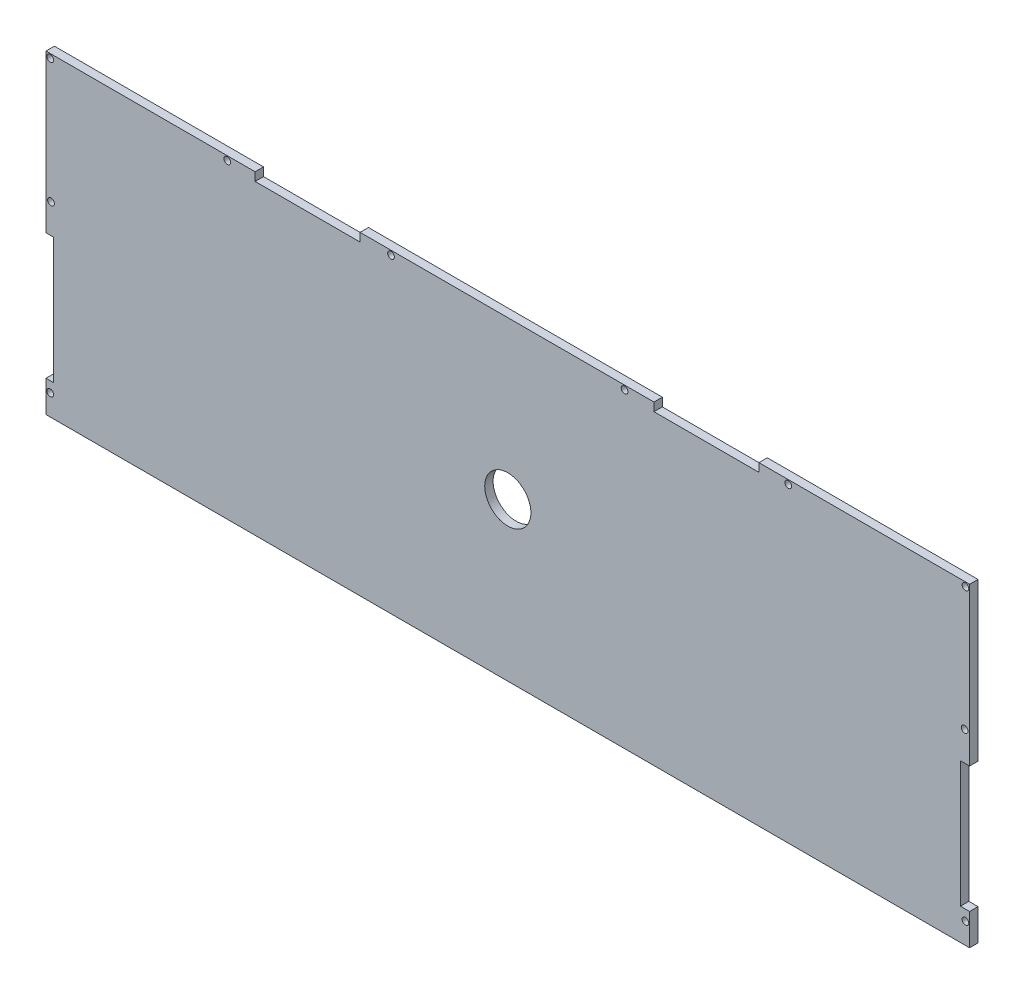
ISO-10303-21;
HEADER;
FILE_DESCRIPTION(('STEP AP214'),'2;1');
FILE_NAME('part.step','',(''),(''),'','','');
FILE_SCHEMA(('AUTOMOTIVE_DESIGN { 1 0 10303 214 1 1 1 1 }'));
ENDSEC;
DATA;
#1=APPLICATION_CONTEXT('core data for automotive mechanical design processes');
#2=APPLICATION_PROTOCOL_DEFINITION('international standard','automotive_design',2000,#1);
#3=PRODUCT_CONTEXT('',#1,'mechanical');
#4=PRODUCT('Part','Part','',(#3));
#5=PRODUCT_RELATED_PRODUCT_CATEGORY('part','',(#4));
#6=PRODUCT_DEFINITION_FORMATION('','',#4);
#7=PRODUCT_DEFINITION_CONTEXT('part definition',#1,'design');
#8=PRODUCT_DEFINITION('design','',#6,#7);
#9=PRODUCT_DEFINITION_SHAPE('','',#8);
#10=(LENGTH_UNIT() NAMED_UNIT(*) SI_UNIT(.MILLI.,.METRE.));
#11=(NAMED_UNIT(*) PLANE_ANGLE_UNIT() SI_UNIT($,.RADIAN.));
#12=(NAMED_UNIT(*) SI_UNIT($,.STERADIAN.) SOLID_ANGLE_UNIT());
#13=UNCERTAINTY_MEASURE_WITH_UNIT(LENGTH_MEASURE(1.E-05),#10,'distance_accuracy_value','');
#14=(GEOMETRIC_REPRESENTATION_CONTEXT(3) GLOBAL_UNCERTAINTY_ASSIGNED_CONTEXT((#13)) GLOBAL_UNIT_ASSIGNED_CONTEXT((#10,
#11,#12)) REPRESENTATION_CONTEXT('',''));
#15=CARTESIAN_POINT('',(0.,0.,0.));
#16=DIRECTION('',(0.,0.,1.));
#17=DIRECTION('',(1.,0.,0.));
#18=AXIS2_PLACEMENT_3D('',#15,#16,#17);
#19=CARTESIAN_POINT('',(-220.,-75.,4.));
#20=DIRECTION('',(1.,0.,0.));
#21=DIRECTION('',(0.,0.,-1.));
#22=AXIS2_PLACEMENT_3D('',#19,#20,#21);
#23=PLANE('',#22);
#24=DIRECTION('',(0.,-1.,0.));
#25=VECTOR('',#24,1.);
#26=CARTESIAN_POINT('',(-220.,-75.,0.));
#27=LINE('',#26,#25);
#28=CARTESIAN_POINT('',(-220.,75.,0.));
#29=VERTEX_POINT('',#28);
#30=CARTESIAN_POINT('',(-220.,0.,0.));
#31=VERTEX_POINT('',#30);
#32=EDGE_CURVE('E305',#29,#31,#27,.T.);
#33=ORIENTED_EDGE('',*,*,#32,.T.);
#34=DIRECTION('',(0.,0.,-1.));
#35=VECTOR('',#34,1.);
#36=CARTESIAN_POINT('',(-220.,0.,4.));
#37=LINE('',#36,#35);
#38=CARTESIAN_POINT('',(-220.,0.,4.));
#39=VERTEX_POINT('',#38);
#40=EDGE_CURVE('E205',#39,#31,#37,.T.);
#41=ORIENTED_EDGE('',*,*,#40,.F.);
#42=DIRECTION('',(0.,-1.,0.));
#43=VECTOR('',#42,1.);
#44=CARTESIAN_POINT('',(-220.,-75.,4.));
#45=LINE('',#44,#43);
#46=CARTESIAN_POINT('',(-220.,75.,4.));
#47=VERTEX_POINT('',#46);
#48=EDGE_CURVE('E290',#47,#39,#45,.T.);
#49=ORIENTED_EDGE('',*,*,#48,.F.);
#50=DIRECTION('',(0.,0.,-1.));
#51=VECTOR('',#50,1.);
#52=CARTESIAN_POINT('',(-220.,75.,4.));
#53=LINE('',#52,#51);
#54=EDGE_CURVE('E303',#47,#29,#53,.T.);
#55=ORIENTED_EDGE('',*,*,#54,.T.);
#56=EDGE_LOOP('',(#33,#41,#49,#55));
#57=FACE_BOUND('',#56,.T.);
#58=ADVANCED_FACE('F33',(#57),#23,.F.);
#59=CARTESIAN_POINT('',(220.,-75.,4.));
#60=DIRECTION('',(-1.,0.,0.));
#61=DIRECTION('',(0.,0.,1.));
#62=AXIS2_PLACEMENT_3D('',#59,#60,#61);
#63=PLANE('',#62);
#64=DIRECTION('',(0.,1.,0.));
#65=VECTOR('',#64,1.);
#66=CARTESIAN_POINT('',(220.,-75.,0.));
#67=LINE('',#66,#65);
#68=CARTESIAN_POINT('',(220.,-75.,0.));
#69=VERTEX_POINT('',#68);
#70=CARTESIAN_POINT('',(220.,-60.,0.));
#71=VERTEX_POINT('',#70);
#72=EDGE_CURVE('E311',#69,#71,#67,.T.);
#73=ORIENTED_EDGE('',*,*,#72,.T.);
#74=DIRECTION('',(0.,0.,-1.));
#75=VECTOR('',#74,1.);
#76=CARTESIAN_POINT('',(220.,-60.,4.));
#77=LINE('',#76,#75);
#78=CARTESIAN_POINT('',(220.,-60.,4.));
#79=VERTEX_POINT('',#78);
#80=EDGE_CURVE('E253',#79,#71,#77,.T.);
#81=ORIENTED_EDGE('',*,*,#80,.F.);
#82=DIRECTION('',(0.,1.,0.));
#83=VECTOR('',#82,1.);
#84=CARTESIAN_POINT('',(220.,-75.,4.));
#85=LINE('',#84,#83);
#86=CARTESIAN_POINT('',(220.,-75.,4.));
#87=VERTEX_POINT('',#86);
#88=EDGE_CURVE('E296',#87,#79,#85,.T.);
#89=ORIENTED_EDGE('',*,*,#88,.F.);
#90=DIRECTION('',(0.,0.,-1.));
#91=VECTOR('',#90,1.);
#92=CARTESIAN_POINT('',(220.,-75.,4.));
#93=LINE('',#92,#91);
#94=EDGE_CURVE('E41',#87,#69,#93,.T.);
#95=ORIENTED_EDGE('',*,*,#94,.T.);
#96=EDGE_LOOP('',(#73,#81,#89,#95));
#97=FACE_BOUND('',#96,.T.);
#98=ADVANCED_FACE('F328',(#97),#63,.F.);
#99=CARTESIAN_POINT('',(220.,75.,4.));
#100=DIRECTION('',(0.,-1.,0.));
#101=DIRECTION('',(1.,0.,0.));
#102=AXIS2_PLACEMENT_3D('',#99,#100,#101);
#103=PLANE('',#102);
#104=DIRECTION('',(-1.,0.,0.));
#105=VECTOR('',#104,1.);
#106=CARTESIAN_POINT('',(220.,75.,0.));
#107=LINE('',#106,#105);
#108=CARTESIAN_POINT('',(220.,75.,0.));
#109=VERTEX_POINT('',#108);
#110=CARTESIAN_POINT('',(119.624864111557,75.,0.));
#111=VERTEX_POINT('',#110);
#112=EDGE_CURVE('E315',#109,#111,#107,.T.);
#113=ORIENTED_EDGE('',*,*,#112,.T.);
#114=DIRECTION('',(0.,0.,-1.));
#115=VECTOR('',#114,1.);
#116=CARTESIAN_POINT('',(119.624864111557,75.,4.));
#117=LINE('',#116,#115);
#118=CARTESIAN_POINT('',(119.624864111557,75.,4.));
#119=VERTEX_POINT('',#118);
#120=EDGE_CURVE('E225',#119,#111,#117,.T.);
#121=ORIENTED_EDGE('',*,*,#120,.F.);
#122=DIRECTION('',(-1.,0.,0.));
#123=VECTOR('',#122,1.);
#124=CARTESIAN_POINT('',(220.,75.,4.));
#125=LINE('',#124,#123);
#126=CARTESIAN_POINT('',(220.,75.,4.));
#127=VERTEX_POINT('',#126);
#128=EDGE_CURVE('E300',#127,#119,#125,.T.);
#129=ORIENTED_EDGE('',*,*,#128,.F.);
#130=DIRECTION('',(0.,0.,-1.));
#131=VECTOR('',#130,1.);
#132=CARTESIAN_POINT('',(220.,75.,4.));
#133=LINE('',#132,#131);
#134=EDGE_CURVE('E321',#127,#109,#133,.T.);
#135=ORIENTED_EDGE('',*,*,#134,.T.);
#136=EDGE_LOOP('',(#113,#121,#129,#135));
#137=FACE_BOUND('',#136,.T.);
#138=ADVANCED_FACE('F393',(#137),#103,.F.);
#139=CARTESIAN_POINT('',(69.6248641115568,75.,4.));
#140=VERTEX_POINT('',#139);
#141=CARTESIAN_POINT('',(-70.3751358884429,75.,4.));
#142=VERTEX_POINT('',#141);
#143=EDGE_CURVE('E304',#140,#142,#125,.T.);
#144=ORIENTED_EDGE('',*,*,#143,.F.);
#145=DIRECTION('',(0.,0.,-1.));
#146=VECTOR('',#145,1.);
#147=CARTESIAN_POINT('',(69.6248641115568,75.,4.));
#148=LINE('',#147,#146);
#149=CARTESIAN_POINT('',(69.6248641115568,75.,0.));
#150=VERTEX_POINT('',#149);
#151=EDGE_CURVE('E228',#140,#150,#148,.T.);
#152=ORIENTED_EDGE('',*,*,#151,.T.);
#153=CARTESIAN_POINT('',(-70.3751358884429,75.,0.));
#154=VERTEX_POINT('',#153);
#155=EDGE_CURVE('E318',#150,#154,#107,.T.);
#156=ORIENTED_EDGE('',*,*,#155,.T.);
#157=DIRECTION('',(0.,0.,-1.));
#158=VECTOR('',#157,1.);
#159=CARTESIAN_POINT('',(-70.3751358884429,75.,4.));
#160=LINE('',#159,#158);
#161=EDGE_CURVE('E248',#142,#154,#160,.T.);
#162=ORIENTED_EDGE('',*,*,#161,.F.);
#163=EDGE_LOOP('',(#144,#152,#156,#162));
#164=FACE_BOUND('',#163,.T.);
#165=ADVANCED_FACE('F362',(#164),#103,.F.);
#166=CARTESIAN_POINT('',(-220.,-60.0000000000001,4.));
#167=VERTEX_POINT('',#166);
#168=CARTESIAN_POINT('',(-220.,-75.,4.));
#169=VERTEX_POINT('',#168);
#170=EDGE_CURVE('E293',#167,#169,#45,.T.);
#171=ORIENTED_EDGE('',*,*,#170,.F.);
#172=DIRECTION('',(0.,0.,-1.));
#173=VECTOR('',#172,1.);
#174=CARTESIAN_POINT('',(-220.,-60.0000000000001,4.));
#175=LINE('',#174,#173);
#176=CARTESIAN_POINT('',(-220.,-60.0000000000001,0.));
#177=VERTEX_POINT('',#176);
#178=EDGE_CURVE('E176',#167,#177,#175,.T.);
#179=ORIENTED_EDGE('',*,*,#178,.T.);
#180=CARTESIAN_POINT('',(-220.,-75.,0.));
#181=VERTEX_POINT('',#180);
#182=EDGE_CURVE('E289',#177,#181,#27,.T.);
#183=ORIENTED_EDGE('',*,*,#182,.T.);
#184=DIRECTION('',(0.,0.,-1.));
#185=VECTOR('',#184,1.);
#186=CARTESIAN_POINT('',(-220.,-75.,4.));
#187=LINE('',#186,#185);
#188=EDGE_CURVE('E11',#169,#181,#187,.T.);
#189=ORIENTED_EDGE('',*,*,#188,.F.);
#190=EDGE_LOOP('',(#171,#179,#183,#189));
#191=FACE_BOUND('',#190,.T.);
#192=ADVANCED_FACE('F35',(#191),#23,.F.);
#193=CARTESIAN_POINT('',(220.,-75.,4.));
#194=DIRECTION('',(0.,1.,0.));
#195=DIRECTION('',(-1.,0.,0.));
#196=AXIS2_PLACEMENT_3D('',#193,#194,#195);
#197=PLANE('',#196);
#198=DIRECTION('',(1.,0.,0.));
#199=VECTOR('',#198,1.);
#200=CARTESIAN_POINT('',(220.,-75.,0.));
#201=LINE('',#200,#199);
#202=EDGE_CURVE('E308',#181,#69,#201,.T.);
#203=ORIENTED_EDGE('',*,*,#202,.T.);
#204=ORIENTED_EDGE('',*,*,#94,.F.);
#205=DIRECTION('',(1.,0.,0.));
#206=VECTOR('',#205,1.);
#207=CARTESIAN_POINT('',(220.,-75.,4.));
#208=LINE('',#207,#206);
#209=EDGE_CURVE('E292',#169,#87,#208,.T.);
#210=ORIENTED_EDGE('',*,*,#209,.F.);
#211=ORIENTED_EDGE('',*,*,#188,.T.);
#212=EDGE_LOOP('',(#203,#204,#210,#211));
#213=FACE_BOUND('',#212,.T.);
#214=ADVANCED_FACE('F343',(#213),#197,.F.);
#215=CARTESIAN_POINT('',(220.,0.,4.));
#216=VERTEX_POINT('',#215);
#217=EDGE_CURVE('E295',#216,#127,#85,.T.);
#218=ORIENTED_EDGE('',*,*,#217,.F.);
#219=DIRECTION('',(0.,0.,-1.));
#220=VECTOR('',#219,1.);
#221=CARTESIAN_POINT('',(220.,0.,4.));
#222=LINE('',#221,#220);
#223=CARTESIAN_POINT('',(220.,0.,0.));
#224=VERTEX_POINT('',#223);
#225=EDGE_CURVE('E255',#216,#224,#222,.T.);
#226=ORIENTED_EDGE('',*,*,#225,.T.);
#227=EDGE_CURVE('E310',#224,#109,#67,.T.);
#228=ORIENTED_EDGE('',*,*,#227,.T.);
#229=ORIENTED_EDGE('',*,*,#134,.F.);
#230=EDGE_LOOP('',(#218,#226,#228,#229));
#231=FACE_BOUND('',#230,.T.);
#232=ADVANCED_FACE('F395',(#231),#63,.F.);
#233=CARTESIAN_POINT('',(-120.375135888443,75.,4.));
#234=VERTEX_POINT('',#233);
#235=EDGE_CURVE('E299',#234,#47,#125,.T.);
#236=ORIENTED_EDGE('',*,*,#235,.F.);
#237=DIRECTION('',(0.,0.,-1.));
#238=VECTOR('',#237,1.);
#239=CARTESIAN_POINT('',(-120.375135888443,75.,4.));
#240=LINE('',#239,#238);
#241=CARTESIAN_POINT('',(-120.375135888443,75.,0.));
#242=VERTEX_POINT('',#241);
#243=EDGE_CURVE('E277',#234,#242,#240,.T.);
#244=ORIENTED_EDGE('',*,*,#243,.T.);
#245=EDGE_CURVE('E314',#242,#29,#107,.T.);
#246=ORIENTED_EDGE('',*,*,#245,.T.);
#247=ORIENTED_EDGE('',*,*,#54,.F.);
#248=EDGE_LOOP('',(#236,#244,#246,#247));
#249=FACE_BOUND('',#248,.T.);
#250=ADVANCED_FACE('F355',(#249),#103,.F.);
#251=CARTESIAN_POINT('',(0.,0.,4.));
#252=DIRECTION('',(0.,0.,1.));
#253=DIRECTION('',(1.,0.,0.));
#254=AXIS2_PLACEMENT_3D('',#251,#252,#253);
#255=PLANE('',#254);
#256=CARTESIAN_POINT('',(133.624864111557,73.,4.));
#257=DIRECTION('',(0.,0.,-1.));
#258=DIRECTION('',(-1.,0.,0.));
#259=AXIS2_PLACEMENT_3D('',#256,#257,#258);
#260=CIRCLE('',#259,1.59999999999999);
#261=CARTESIAN_POINT('',(132.024864111557,73.,4.));
#262=VERTEX_POINT('',#261);
#263=EDGE_CURVE('E530',#262,#262,#260,.T.);
#264=ORIENTED_EDGE('',*,*,#263,.T.);
#265=EDGE_LOOP('',(#264));
#266=FACE_BOUND('',#265,.T.);
#267=CARTESIAN_POINT('',(-218.,-65.,4.));
#268=DIRECTION('',(0.,0.,-1.));
#269=DIRECTION('',(1.,0.,0.));
#270=AXIS2_PLACEMENT_3D('',#267,#268,#269);
#271=CIRCLE('',#270,1.59999999999999);
#272=CARTESIAN_POINT('',(-216.4,-65.,4.));
#273=VERTEX_POINT('',#272);
#274=EDGE_CURVE('E535',#273,#273,#271,.T.);
#275=ORIENTED_EDGE('',*,*,#274,.T.);
#276=EDGE_LOOP('',(#275));
#277=FACE_BOUND('',#276,.T.);
#278=CARTESIAN_POINT('',(55.6248641115568,73.,4.));
#279=DIRECTION('',(0.,0.,-1.));
#280=DIRECTION('',(-1.,0.,0.));
#281=AXIS2_PLACEMENT_3D('',#278,#279,#280);
#282=CIRCLE('',#281,1.59999999999999);
#283=CARTESIAN_POINT('',(54.0248641115568,73.,4.));
#284=VERTEX_POINT('',#283);
#285=EDGE_CURVE('E542',#284,#284,#282,.T.);
#286=ORIENTED_EDGE('',*,*,#285,.T.);
#287=EDGE_LOOP('',(#286));
#288=FACE_BOUND('',#287,.T.);
#289=CARTESIAN_POINT('',(-218.,73.,4.));
#290=DIRECTION('',(0.,0.,-1.));
#291=DIRECTION('',(1.,0.,0.));
#292=AXIS2_PLACEMENT_3D('',#289,#290,#291);
#293=CIRCLE('',#292,1.59999999999999);
#294=CARTESIAN_POINT('',(-216.4,73.,4.));
#295=VERTEX_POINT('',#294);
#296=EDGE_CURVE('E548',#295,#295,#293,.T.);
#297=ORIENTED_EDGE('',*,*,#296,.T.);
#298=EDGE_LOOP('',(#297));
#299=FACE_BOUND('',#298,.T.);
#300=CARTESIAN_POINT('',(-55.6248641115568,73.,4.));
#301=DIRECTION('',(0.,0.,-1.));
#302=DIRECTION('',(1.,0.,0.));
#303=AXIS2_PLACEMENT_3D('',#300,#301,#302);
#304=CIRCLE('',#303,1.59999999999999);
#305=CARTESIAN_POINT('',(-54.0248641115568,73.,4.));
#306=VERTEX_POINT('',#305);
#307=EDGE_CURVE('E504',#306,#306,#304,.T.);
#308=ORIENTED_EDGE('',*,*,#307,.T.);
#309=EDGE_LOOP('',(#308));
#310=FACE_BOUND('',#309,.T.);
#311=CARTESIAN_POINT('',(218.,73.,4.));
#312=DIRECTION('',(0.,0.,-1.));
#313=DIRECTION('',(-1.,0.,0.));
#314=AXIS2_PLACEMENT_3D('',#311,#312,#313);
#315=CIRCLE('',#314,1.59999999999999);
#316=CARTESIAN_POINT('',(216.4,73.,4.));
#317=VERTEX_POINT('',#316);
#318=EDGE_CURVE('E510',#317,#317,#315,.T.);
#319=ORIENTED_EDGE('',*,*,#318,.T.);
#320=EDGE_LOOP('',(#319));
#321=FACE_BOUND('',#320,.T.);
#322=CARTESIAN_POINT('',(218.,-65.,4.));
#323=DIRECTION('',(0.,0.,-1.));
#324=DIRECTION('',(-1.,0.,0.));
#325=AXIS2_PLACEMENT_3D('',#322,#323,#324);
#326=CIRCLE('',#325,1.59999999999999);
#327=CARTESIAN_POINT('',(216.4,-65.,4.));
#328=VERTEX_POINT('',#327);
#329=EDGE_CURVE('E517',#328,#328,#326,.T.);
#330=ORIENTED_EDGE('',*,*,#329,.T.);
#331=EDGE_LOOP('',(#330));
#332=FACE_BOUND('',#331,.T.);
#333=CARTESIAN_POINT('',(-133.624864111557,73.,4.));
#334=DIRECTION('',(0.,0.,-1.));
#335=DIRECTION('',(1.,0.,0.));
#336=AXIS2_PLACEMENT_3D('',#333,#334,#335);
#337=CIRCLE('',#336,1.59999999999999);
#338=CARTESIAN_POINT('',(-132.024864111557,73.,4.));
#339=VERTEX_POINT('',#338);
#340=EDGE_CURVE('E523',#339,#339,#337,.T.);
#341=ORIENTED_EDGE('',*,*,#340,.T.);
#342=EDGE_LOOP('',(#341));
#343=FACE_BOUND('',#342,.T.);
#344=CARTESIAN_POINT('',(-217.624864111557,14.0000000000007,4.));
#345=DIRECTION('',(0.,0.,-1.));
#346=DIRECTION('',(1.,0.,0.));
#347=AXIS2_PLACEMENT_3D('',#344,#345,#346);
#348=CIRCLE('',#347,1.59999999999999);
#349=CARTESIAN_POINT('',(-216.024864111557,14.0000000000007,4.));
#350=VERTEX_POINT('',#349);
#351=EDGE_CURVE('E555',#350,#350,#348,.T.);
#352=ORIENTED_EDGE('',*,*,#351,.T.);
#353=EDGE_LOOP('',(#352));
#354=FACE_BOUND('',#353,.T.);
#355=CARTESIAN_POINT('',(217.624864111557,14.0000000000007,4.));
#356=DIRECTION('',(0.,0.,-1.));
#357=DIRECTION('',(-1.,0.,0.));
#358=AXIS2_PLACEMENT_3D('',#355,#356,#357);
#359=CIRCLE('',#358,1.59999999999999);
#360=CARTESIAN_POINT('',(216.024864111557,14.0000000000007,4.));
#361=VERTEX_POINT('',#360);
#362=EDGE_CURVE('E221',#361,#361,#359,.T.);
#363=ORIENTED_EDGE('',*,*,#362,.T.);
#364=EDGE_LOOP('',(#363));
#365=FACE_BOUND('',#364,.T.);
#366=DIRECTION('',(1.,0.,0.));
#367=VECTOR('',#366,1.);
#368=CARTESIAN_POINT('',(-216.375135888443,0.,4.));
#369=LINE('',#368,#367);
#370=CARTESIAN_POINT('',(-216.375135888443,0.,4.));
#371=VERTEX_POINT('',#370);
#372=EDGE_CURVE('E177',#39,#371,#369,.T.);
#373=ORIENTED_EDGE('',*,*,#372,.T.);
#374=DIRECTION('',(0.,-1.,0.));
#375=VECTOR('',#374,1.);
#376=CARTESIAN_POINT('',(-216.375135888443,-60.0000000000001,4.));
#377=LINE('',#376,#375);
#378=CARTESIAN_POINT('',(-216.375135888443,-60.0000000000001,4.));
#379=VERTEX_POINT('',#378);
#380=EDGE_CURVE('E172',#371,#379,#377,.T.);
#381=ORIENTED_EDGE('',*,*,#380,.T.);
#382=DIRECTION('',(-1.,0.,0.));
#383=VECTOR('',#382,1.);
#384=CARTESIAN_POINT('',(-216.375135888443,-60.0000000000001,4.));
#385=LINE('',#384,#383);
#386=EDGE_CURVE('E180',#379,#167,#385,.T.);
#387=ORIENTED_EDGE('',*,*,#386,.T.);
#388=ORIENTED_EDGE('',*,*,#170,.T.);
#389=ORIENTED_EDGE('',*,*,#209,.T.);
#390=ORIENTED_EDGE('',*,*,#88,.T.);
#391=DIRECTION('',(-1.,0.,0.));
#392=VECTOR('',#391,1.);
#393=CARTESIAN_POINT('',(215.624864111557,-60.,4.));
#394=LINE('',#393,#392);
#395=CARTESIAN_POINT('',(215.624864111557,-60.,4.));
#396=VERTEX_POINT('',#395);
#397=EDGE_CURVE('E241',#79,#396,#394,.T.);
#398=ORIENTED_EDGE('',*,*,#397,.T.);
#399=DIRECTION('',(0.,1.,0.));
#400=VECTOR('',#399,1.);
#401=CARTESIAN_POINT('',(215.624864111557,-60.,4.));
#402=LINE('',#401,#400);
#403=CARTESIAN_POINT('',(215.624864111557,0.,4.));
#404=VERTEX_POINT('',#403);
#405=EDGE_CURVE('E234',#396,#404,#402,.T.);
#406=ORIENTED_EDGE('',*,*,#405,.T.);
#407=DIRECTION('',(1.,0.,0.));
#408=VECTOR('',#407,1.);
#409=CARTESIAN_POINT('',(215.624864111557,0.,4.));
#410=LINE('',#409,#408);
#411=EDGE_CURVE('E237',#404,#216,#410,.T.);
#412=ORIENTED_EDGE('',*,*,#411,.T.);
#413=ORIENTED_EDGE('',*,*,#217,.T.);
#414=ORIENTED_EDGE('',*,*,#128,.T.);
#415=DIRECTION('',(0.,-1.,0.));
#416=VECTOR('',#415,1.);
#417=CARTESIAN_POINT('',(119.624864111557,70.9999999999998,4.));
#418=LINE('',#417,#416);
#419=CARTESIAN_POINT('',(119.624864111557,70.9999999999998,4.));
#420=VERTEX_POINT('',#419);
#421=EDGE_CURVE('E208',#119,#420,#418,.T.);
#422=ORIENTED_EDGE('',*,*,#421,.T.);
#423=DIRECTION('',(-1.,0.,0.));
#424=VECTOR('',#423,1.);
#425=CARTESIAN_POINT('',(119.624864111557,70.9999999999998,4.));
#426=LINE('',#425,#424);
#427=CARTESIAN_POINT('',(69.6248641115568,70.9999999999998,4.));
#428=VERTEX_POINT('',#427);
#429=EDGE_CURVE('E211',#420,#428,#426,.T.);
#430=ORIENTED_EDGE('',*,*,#429,.T.);
#431=DIRECTION('',(0.,1.,0.));
#432=VECTOR('',#431,1.);
#433=CARTESIAN_POINT('',(69.6248641115568,70.9999999999998,4.));
#434=LINE('',#433,#432);
#435=EDGE_CURVE('E215',#428,#140,#434,.T.);
#436=ORIENTED_EDGE('',*,*,#435,.T.);
#437=ORIENTED_EDGE('',*,*,#143,.T.);
#438=DIRECTION('',(0.,-1.,0.));
#439=VECTOR('',#438,1.);
#440=CARTESIAN_POINT('',(-70.3751358884429,70.9999999999998,4.));
#441=LINE('',#440,#439);
#442=CARTESIAN_POINT('',(-70.3751358884429,70.9999999999998,4.));
#443=VERTEX_POINT('',#442);
#444=EDGE_CURVE('E260',#142,#443,#441,.T.);
#445=ORIENTED_EDGE('',*,*,#444,.T.);
#446=DIRECTION('',(-1.,0.,0.));
#447=VECTOR('',#446,1.);
#448=CARTESIAN_POINT('',(-70.3751358884429,70.9999999999998,4.));
#449=LINE('',#448,#447);
#450=CARTESIAN_POINT('',(-120.375135888443,70.9999999999998,4.));
#451=VERTEX_POINT('',#450);
#452=EDGE_CURVE('E263',#443,#451,#449,.T.);
#453=ORIENTED_EDGE('',*,*,#452,.T.);
#454=DIRECTION('',(0.,1.,0.));
#455=VECTOR('',#454,1.);
#456=CARTESIAN_POINT('',(-120.375135888443,70.9999999999998,4.));
#457=LINE('',#456,#455);
#458=EDGE_CURVE('E267',#451,#234,#457,.T.);
#459=ORIENTED_EDGE('',*,*,#458,.T.);
#460=ORIENTED_EDGE('',*,*,#235,.T.);
#461=ORIENTED_EDGE('',*,*,#48,.T.);
#462=EDGE_LOOP('',(#373,#381,#387,#388,#389,#390,#398,#406,#412,#413,#414,#422,#430,#436,#437,
#445,#453,#459,#460,#461));
#463=FACE_BOUND('',#462,.T.);
#464=CARTESIAN_POINT('',(0.,0.,4.));
#465=DIRECTION('',(0.,0.,1.));
#466=DIRECTION('',(1.,0.,0.));
#467=AXIS2_PLACEMENT_3D('',#464,#465,#466);
#468=CIRCLE('',#467,11.);
#469=CARTESIAN_POINT('',(11.,0.,4.));
#470=VERTEX_POINT('',#469);
#471=EDGE_CURVE('E286',#470,#470,#468,.T.);
#472=ORIENTED_EDGE('',*,*,#471,.F.);
#473=EDGE_LOOP('',(#472));
#474=FACE_BOUND('',#473,.T.);
#475=ADVANCED_FACE('F186',(#266,#277,#288,#299,#310,#321,#332,#343,#354,#365,#463,#474),#255,.T.);
#476=CARTESIAN_POINT('',(0.,0.,0.));
#477=DIRECTION('',(0.,0.,1.));
#478=DIRECTION('',(1.,0.,0.));
#479=AXIS2_PLACEMENT_3D('',#476,#477,#478);
#480=PLANE('',#479);
#481=CARTESIAN_POINT('',(133.624864111557,73.,0.));
#482=DIRECTION('',(0.,0.,-1.));
#483=DIRECTION('',(-1.,0.,0.));
#484=AXIS2_PLACEMENT_3D('',#481,#482,#483);
#485=CIRCLE('',#484,1.59999999999999);
#486=CARTESIAN_POINT('',(132.024864111557,73.,0.));
#487=VERTEX_POINT('',#486);
#488=EDGE_CURVE('E468',#487,#487,#485,.T.);
#489=ORIENTED_EDGE('',*,*,#488,.F.);
#490=EDGE_LOOP('',(#489));
#491=FACE_BOUND('',#490,.T.);
#492=CARTESIAN_POINT('',(-218.,-65.,0.));
#493=DIRECTION('',(0.,0.,-1.));
#494=DIRECTION('',(1.,0.,0.));
#495=AXIS2_PLACEMENT_3D('',#492,#493,#494);
#496=CIRCLE('',#495,1.59999999999999);
#497=CARTESIAN_POINT('',(-216.4,-65.,0.));
#498=VERTEX_POINT('',#497);
#499=EDGE_CURVE('E472',#498,#498,#496,.T.);
#500=ORIENTED_EDGE('',*,*,#499,.F.);
#501=EDGE_LOOP('',(#500));
#502=FACE_BOUND('',#501,.T.);
#503=CARTESIAN_POINT('',(55.6248641115568,73.,0.));
#504=DIRECTION('',(0.,0.,-1.));
#505=DIRECTION('',(-1.,0.,0.));
#506=AXIS2_PLACEMENT_3D('',#503,#504,#505);
#507=CIRCLE('',#506,1.59999999999999);
#508=CARTESIAN_POINT('',(54.0248641115568,73.,0.));
#509=VERTEX_POINT('',#508);
#510=EDGE_CURVE('E476',#509,#509,#507,.T.);
#511=ORIENTED_EDGE('',*,*,#510,.F.);
#512=EDGE_LOOP('',(#511));
#513=FACE_BOUND('',#512,.T.);
#514=CARTESIAN_POINT('',(-218.,73.,0.));
#515=DIRECTION('',(0.,0.,-1.));
#516=DIRECTION('',(1.,0.,0.));
#517=AXIS2_PLACEMENT_3D('',#514,#515,#516);
#518=CIRCLE('',#517,1.59999999999999);
#519=CARTESIAN_POINT('',(-216.4,73.,0.));
#520=VERTEX_POINT('',#519);
#521=EDGE_CURVE('E480',#520,#520,#518,.T.);
#522=ORIENTED_EDGE('',*,*,#521,.F.);
#523=EDGE_LOOP('',(#522));
#524=FACE_BOUND('',#523,.T.);
#525=CARTESIAN_POINT('',(-55.6248641115568,73.,0.));
#526=DIRECTION('',(0.,0.,-1.));
#527=DIRECTION('',(1.,0.,0.));
#528=AXIS2_PLACEMENT_3D('',#525,#526,#527);
#529=CIRCLE('',#528,1.59999999999999);
#530=CARTESIAN_POINT('',(-54.0248641115568,73.,0.));
#531=VERTEX_POINT('',#530);
#532=EDGE_CURVE('E484',#531,#531,#529,.T.);
#533=ORIENTED_EDGE('',*,*,#532,.F.);
#534=EDGE_LOOP('',(#533));
#535=FACE_BOUND('',#534,.T.);
#536=CARTESIAN_POINT('',(218.,73.,0.));
#537=DIRECTION('',(0.,0.,-1.));
#538=DIRECTION('',(-1.,0.,0.));
#539=AXIS2_PLACEMENT_3D('',#536,#537,#538);
#540=CIRCLE('',#539,1.59999999999999);
#541=CARTESIAN_POINT('',(216.4,73.,0.));
#542=VERTEX_POINT('',#541);
#543=EDGE_CURVE('E488',#542,#542,#540,.T.);
#544=ORIENTED_EDGE('',*,*,#543,.F.);
#545=EDGE_LOOP('',(#544));
#546=FACE_BOUND('',#545,.T.);
#547=CARTESIAN_POINT('',(218.,-65.,0.));
#548=DIRECTION('',(0.,0.,-1.));
#549=DIRECTION('',(-1.,0.,0.));
#550=AXIS2_PLACEMENT_3D('',#547,#548,#549);
#551=CIRCLE('',#550,1.59999999999999);
#552=CARTESIAN_POINT('',(216.4,-65.,0.));
#553=VERTEX_POINT('',#552);
#554=EDGE_CURVE('E492',#553,#553,#551,.T.);
#555=ORIENTED_EDGE('',*,*,#554,.F.);
#556=EDGE_LOOP('',(#555));
#557=FACE_BOUND('',#556,.T.);
#558=CARTESIAN_POINT('',(-133.624864111557,73.,0.));
#559=DIRECTION('',(0.,0.,-1.));
#560=DIRECTION('',(1.,0.,0.));
#561=AXIS2_PLACEMENT_3D('',#558,#559,#560);
#562=CIRCLE('',#561,1.59999999999999);
#563=CARTESIAN_POINT('',(-132.024864111557,73.,0.));
#564=VERTEX_POINT('',#563);
#565=EDGE_CURVE('E496',#564,#564,#562,.T.);
#566=ORIENTED_EDGE('',*,*,#565,.F.);
#567=EDGE_LOOP('',(#566));
#568=FACE_BOUND('',#567,.T.);
#569=CARTESIAN_POINT('',(-217.624864111557,14.0000000000007,0.));
#570=DIRECTION('',(0.,0.,-1.));
#571=DIRECTION('',(1.,0.,0.));
#572=AXIS2_PLACEMENT_3D('',#569,#570,#571);
#573=CIRCLE('',#572,1.59999999999999);
#574=CARTESIAN_POINT('',(-216.024864111557,14.0000000000007,0.));
#575=VERTEX_POINT('',#574);
#576=EDGE_CURVE('E500',#575,#575,#573,.T.);
#577=ORIENTED_EDGE('',*,*,#576,.F.);
#578=EDGE_LOOP('',(#577));
#579=FACE_BOUND('',#578,.T.);
#580=CARTESIAN_POINT('',(217.624864111557,14.0000000000007,0.));
#581=DIRECTION('',(0.,0.,-1.));
#582=DIRECTION('',(-1.,0.,0.));
#583=AXIS2_PLACEMENT_3D('',#580,#581,#582);
#584=CIRCLE('',#583,1.59999999999999);
#585=CARTESIAN_POINT('',(216.024864111557,14.0000000000007,0.));
#586=VERTEX_POINT('',#585);
#587=EDGE_CURVE('E195',#586,#586,#584,.T.);
#588=ORIENTED_EDGE('',*,*,#587,.F.);
#589=EDGE_LOOP('',(#588));
#590=FACE_BOUND('',#589,.T.);
#591=CARTESIAN_POINT('',(0.,0.,0.));
#592=DIRECTION('',(0.,0.,-1.));
#593=DIRECTION('',(-1.,0.,0.));
#594=AXIS2_PLACEMENT_3D('',#591,#592,#593);
#595=CIRCLE('',#594,11.);
#596=CARTESIAN_POINT('',(-11.,0.,0.));
#597=VERTEX_POINT('',#596);
#598=EDGE_CURVE('E204',#597,#597,#595,.T.);
#599=ORIENTED_EDGE('',*,*,#598,.F.);
#600=EDGE_LOOP('',(#599));
#601=FACE_BOUND('',#600,.T.);
#602=DIRECTION('',(0.,-1.,0.));
#603=VECTOR('',#602,1.);
#604=CARTESIAN_POINT('',(-216.375135888443,-60.0000000000001,0.));
#605=LINE('',#604,#603);
#606=CARTESIAN_POINT('',(-216.375135888443,0.,0.));
#607=VERTEX_POINT('',#606);
#608=CARTESIAN_POINT('',(-216.375135888443,-60.0000000000001,0.));
#609=VERTEX_POINT('',#608);
#610=EDGE_CURVE('E48',#607,#609,#605,.T.);
#611=ORIENTED_EDGE('',*,*,#610,.F.);
#612=DIRECTION('',(1.,0.,0.));
#613=VECTOR('',#612,1.);
#614=CARTESIAN_POINT('',(-216.375135888443,0.,0.));
#615=LINE('',#614,#613);
#616=EDGE_CURVE('E189',#31,#607,#615,.T.);
#617=ORIENTED_EDGE('',*,*,#616,.F.);
#618=ORIENTED_EDGE('',*,*,#32,.F.);
#619=ORIENTED_EDGE('',*,*,#245,.F.);
#620=DIRECTION('',(0.,1.,0.));
#621=VECTOR('',#620,1.);
#622=CARTESIAN_POINT('',(-120.375135888443,70.9999999999998,0.));
#623=LINE('',#622,#621);
#624=CARTESIAN_POINT('',(-120.375135888443,70.9999999999998,0.));
#625=VERTEX_POINT('',#624);
#626=EDGE_CURVE('E264',#625,#242,#623,.T.);
#627=ORIENTED_EDGE('',*,*,#626,.F.);
#628=DIRECTION('',(-1.,0.,0.));
#629=VECTOR('',#628,1.);
#630=CARTESIAN_POINT('',(-70.3751358884429,70.9999999999998,0.));
#631=LINE('',#630,#629);
#632=CARTESIAN_POINT('',(-70.3751358884429,70.9999999999998,0.));
#633=VERTEX_POINT('',#632);
#634=EDGE_CURVE('E272',#633,#625,#631,.T.);
#635=ORIENTED_EDGE('',*,*,#634,.F.);
#636=DIRECTION('',(0.,-1.,0.));
#637=VECTOR('',#636,1.);
#638=CARTESIAN_POINT('',(-70.3751358884429,70.9999999999998,0.));
#639=LINE('',#638,#637);
#640=EDGE_CURVE('E227',#154,#633,#639,.T.);
#641=ORIENTED_EDGE('',*,*,#640,.F.);
#642=ORIENTED_EDGE('',*,*,#155,.F.);
#643=DIRECTION('',(0.,1.,0.));
#644=VECTOR('',#643,1.);
#645=CARTESIAN_POINT('',(69.6248641115568,70.9999999999998,0.));
#646=LINE('',#645,#644);
#647=CARTESIAN_POINT('',(69.6248641115568,70.9999999999998,0.));
#648=VERTEX_POINT('',#647);
#649=EDGE_CURVE('E212',#648,#150,#646,.T.);
#650=ORIENTED_EDGE('',*,*,#649,.F.);
#651=DIRECTION('',(-1.,0.,0.));
#652=VECTOR('',#651,1.);
#653=CARTESIAN_POINT('',(119.624864111557,70.9999999999998,0.));
#654=LINE('',#653,#652);
#655=CARTESIAN_POINT('',(119.624864111557,70.9999999999998,0.));
#656=VERTEX_POINT('',#655);
#657=EDGE_CURVE('E220',#656,#648,#654,.T.);
#658=ORIENTED_EDGE('',*,*,#657,.F.);
#659=DIRECTION('',(0.,-1.,0.));
#660=VECTOR('',#659,1.);
#661=CARTESIAN_POINT('',(119.624864111557,70.9999999999998,0.));
#662=LINE('',#661,#660);
#663=EDGE_CURVE('E56',#111,#656,#662,.T.);
#664=ORIENTED_EDGE('',*,*,#663,.F.);
#665=ORIENTED_EDGE('',*,*,#112,.F.);
#666=ORIENTED_EDGE('',*,*,#227,.F.);
#667=DIRECTION('',(1.,0.,0.));
#668=VECTOR('',#667,1.);
#669=CARTESIAN_POINT('',(215.624864111557,0.,0.));
#670=LINE('',#669,#668);
#671=CARTESIAN_POINT('',(215.624864111557,6.81690851829715E-13,0.));
#672=VERTEX_POINT('',#671);
#673=EDGE_CURVE('E247',#672,#224,#670,.T.);
#674=ORIENTED_EDGE('',*,*,#673,.F.);
#675=DIRECTION('',(0.,1.,0.));
#676=VECTOR('',#675,1.);
#677=CARTESIAN_POINT('',(215.624864111557,-60.,0.));
#678=LINE('',#677,#676);
#679=CARTESIAN_POINT('',(215.624864111557,-60.,0.));
#680=VERTEX_POINT('',#679);
#681=EDGE_CURVE('E245',#680,#672,#678,.T.);
#682=ORIENTED_EDGE('',*,*,#681,.F.);
#683=DIRECTION('',(-1.,0.,0.));
#684=VECTOR('',#683,1.);
#685=CARTESIAN_POINT('',(215.624864111557,-60.,0.));
#686=LINE('',#685,#684);
#687=EDGE_CURVE('E238',#71,#680,#686,.T.);
#688=ORIENTED_EDGE('',*,*,#687,.F.);
#689=ORIENTED_EDGE('',*,*,#72,.F.);
#690=ORIENTED_EDGE('',*,*,#202,.F.);
#691=ORIENTED_EDGE('',*,*,#182,.F.);
#692=DIRECTION('',(-1.,0.,0.));
#693=VECTOR('',#692,1.);
#694=CARTESIAN_POINT('',(-216.375135888443,-60.0000000000001,0.));
#695=LINE('',#694,#693);
#696=EDGE_CURVE('E192',#609,#177,#695,.T.);
#697=ORIENTED_EDGE('',*,*,#696,.F.);
#698=EDGE_LOOP('',(#611,#617,#618,#619,#627,#635,#641,#642,#650,#658,#664,#665,#666,#674,#682,
#688,#689,#690,#691,#697));
#699=FACE_BOUND('',#698,.T.);
#700=ADVANCED_FACE('F335',(#491,#502,#513,#524,#535,#546,#557,#568,#579,#590,#601,#699),#480,.F.);
#701=CARTESIAN_POINT('',(0.,0.,10.));
#702=DIRECTION('',(0.,0.,-1.));
#703=DIRECTION('',(-1.,0.,0.));
#704=AXIS2_PLACEMENT_3D('',#701,#702,#703);
#705=CYLINDRICAL_SURFACE('',#704,11.);
#706=ORIENTED_EDGE('',*,*,#471,.T.);
#707=EDGE_LOOP('',(#706));
#708=FACE_BOUND('',#707,.T.);
#709=ORIENTED_EDGE('',*,*,#598,.T.);
#710=EDGE_LOOP('',(#709));
#711=FACE_BOUND('',#710,.T.);
#712=ADVANCED_FACE('F447',(#708,#711),#705,.F.);
#713=CARTESIAN_POINT('',(215.624864111557,-60.,4.));
#714=DIRECTION('',(-1.,0.,0.));
#715=DIRECTION('',(0.,0.,1.));
#716=AXIS2_PLACEMENT_3D('',#713,#714,#715);
#717=PLANE('',#716);
#718=ORIENTED_EDGE('',*,*,#681,.T.);
#719=DIRECTION('',(0.,0.,-1.));
#720=VECTOR('',#719,1.);
#721=CARTESIAN_POINT('',(215.624864111557,0.,4.));
#722=LINE('',#721,#720);
#723=EDGE_CURVE('E244',#404,#672,#722,.T.);
#724=ORIENTED_EDGE('',*,*,#723,.F.);
#725=ORIENTED_EDGE('',*,*,#405,.F.);
#726=DIRECTION('',(0.,0.,-1.));
#727=VECTOR('',#726,1.);
#728=CARTESIAN_POINT('',(215.624864111557,-60.,4.));
#729=LINE('',#728,#727);
#730=EDGE_CURVE('E200',#396,#680,#729,.T.);
#731=ORIENTED_EDGE('',*,*,#730,.T.);
#732=EDGE_LOOP('',(#718,#724,#725,#731));
#733=FACE_BOUND('',#732,.T.);
#734=ADVANCED_FACE('F444',(#733),#717,.F.);
#735=CARTESIAN_POINT('',(215.624864111557,-60.,4.));
#736=DIRECTION('',(0.,-1.,0.));
#737=DIRECTION('',(0.,0.,-1.));
#738=AXIS2_PLACEMENT_3D('',#735,#736,#737);
#739=PLANE('',#738);
#740=ORIENTED_EDGE('',*,*,#687,.T.);
#741=ORIENTED_EDGE('',*,*,#730,.F.);
#742=ORIENTED_EDGE('',*,*,#397,.F.);
#743=ORIENTED_EDGE('',*,*,#80,.T.);
#744=EDGE_LOOP('',(#740,#741,#742,#743));
#745=FACE_BOUND('',#744,.T.);
#746=ADVANCED_FACE('F340',(#745),#739,.F.);
#747=CARTESIAN_POINT('',(215.624864111557,0.,4.));
#748=DIRECTION('',(0.,1.,0.));
#749=DIRECTION('',(-1.,0.,0.));
#750=AXIS2_PLACEMENT_3D('',#747,#748,#749);
#751=PLANE('',#750);
#752=ORIENTED_EDGE('',*,*,#673,.T.);
#753=ORIENTED_EDGE('',*,*,#225,.F.);
#754=ORIENTED_EDGE('',*,*,#411,.F.);
#755=ORIENTED_EDGE('',*,*,#723,.T.);
#756=EDGE_LOOP('',(#752,#753,#754,#755));
#757=FACE_BOUND('',#756,.T.);
#758=ADVANCED_FACE('F385',(#757),#751,.F.);
#759=CARTESIAN_POINT('',(-70.3751358884429,70.9999999999998,4.));
#760=DIRECTION('',(1.,0.,0.));
#761=DIRECTION('',(0.,0.,-1.));
#762=AXIS2_PLACEMENT_3D('',#759,#760,#761);
#763=PLANE('',#762);
#764=ORIENTED_EDGE('',*,*,#640,.T.);
#765=DIRECTION('',(0.,0.,-1.));
#766=VECTOR('',#765,1.);
#767=CARTESIAN_POINT('',(-70.3751358884429,70.9999999999998,4.));
#768=LINE('',#767,#766);
#769=EDGE_CURVE('E270',#443,#633,#768,.T.);
#770=ORIENTED_EDGE('',*,*,#769,.F.);
#771=ORIENTED_EDGE('',*,*,#444,.F.);
#772=ORIENTED_EDGE('',*,*,#161,.T.);
#773=EDGE_LOOP('',(#764,#770,#771,#772));
#774=FACE_BOUND('',#773,.T.);
#775=ADVANCED_FACE('F369',(#774),#763,.F.);
#776=CARTESIAN_POINT('',(-120.375135888443,70.9999999999998,4.));
#777=DIRECTION('',(-1.,0.,0.));
#778=DIRECTION('',(0.,0.,1.));
#779=AXIS2_PLACEMENT_3D('',#776,#777,#778);
#780=PLANE('',#779);
#781=ORIENTED_EDGE('',*,*,#626,.T.);
#782=ORIENTED_EDGE('',*,*,#243,.F.);
#783=ORIENTED_EDGE('',*,*,#458,.F.);
#784=DIRECTION('',(0.,0.,-1.));
#785=VECTOR('',#784,1.);
#786=CARTESIAN_POINT('',(-120.375135888443,70.9999999999998,4.));
#787=LINE('',#786,#785);
#788=EDGE_CURVE('E280',#451,#625,#787,.T.);
#789=ORIENTED_EDGE('',*,*,#788,.T.);
#790=EDGE_LOOP('',(#781,#782,#783,#789));
#791=FACE_BOUND('',#790,.T.);
#792=ADVANCED_FACE('F376',(#791),#780,.F.);
#793=CARTESIAN_POINT('',(-70.3751358884429,70.9999999999998,4.));
#794=DIRECTION('',(0.,-1.,0.));
#795=DIRECTION('',(0.,0.,-1.));
#796=AXIS2_PLACEMENT_3D('',#793,#794,#795);
#797=PLANE('',#796);
#798=ORIENTED_EDGE('',*,*,#634,.T.);
#799=ORIENTED_EDGE('',*,*,#788,.F.);
#800=ORIENTED_EDGE('',*,*,#452,.F.);
#801=ORIENTED_EDGE('',*,*,#769,.T.);
#802=EDGE_LOOP('',(#798,#799,#800,#801));
#803=FACE_BOUND('',#802,.T.);
#804=ADVANCED_FACE('F372',(#803),#797,.F.);
#805=CARTESIAN_POINT('',(119.624864111557,70.9999999999998,4.));
#806=DIRECTION('',(1.,0.,0.));
#807=DIRECTION('',(0.,0.,-1.));
#808=AXIS2_PLACEMENT_3D('',#805,#806,#807);
#809=PLANE('',#808);
#810=ORIENTED_EDGE('',*,*,#663,.T.);
#811=DIRECTION('',(0.,0.,-1.));
#812=VECTOR('',#811,1.);
#813=CARTESIAN_POINT('',(119.624864111557,70.9999999999998,4.));
#814=LINE('',#813,#812);
#815=EDGE_CURVE('E218',#420,#656,#814,.T.);
#816=ORIENTED_EDGE('',*,*,#815,.F.);
#817=ORIENTED_EDGE('',*,*,#421,.F.);
#818=ORIENTED_EDGE('',*,*,#120,.T.);
#819=EDGE_LOOP('',(#810,#816,#817,#818));
#820=FACE_BOUND('',#819,.T.);
#821=ADVANCED_FACE('F383',(#820),#809,.F.);
#822=CARTESIAN_POINT('',(69.6248641115568,70.9999999999998,4.));
#823=DIRECTION('',(-1.,0.,0.));
#824=DIRECTION('',(0.,-1.,0.));
#825=AXIS2_PLACEMENT_3D('',#822,#823,#824);
#826=PLANE('',#825);
#827=ORIENTED_EDGE('',*,*,#649,.T.);
#828=ORIENTED_EDGE('',*,*,#151,.F.);
#829=ORIENTED_EDGE('',*,*,#435,.F.);
#830=DIRECTION('',(0.,0.,-1.));
#831=VECTOR('',#830,1.);
#832=CARTESIAN_POINT('',(69.6248641115568,70.9999999999998,4.));
#833=LINE('',#832,#831);
#834=EDGE_CURVE('E231',#428,#648,#833,.T.);
#835=ORIENTED_EDGE('',*,*,#834,.T.);
#836=EDGE_LOOP('',(#827,#828,#829,#835));
#837=FACE_BOUND('',#836,.T.);
#838=ADVANCED_FACE('F430',(#837),#826,.F.);
#839=CARTESIAN_POINT('',(119.624864111557,70.9999999999998,4.));
#840=DIRECTION('',(0.,-1.,0.));
#841=DIRECTION('',(0.,0.,-1.));
#842=AXIS2_PLACEMENT_3D('',#839,#840,#841);
#843=PLANE('',#842);
#844=ORIENTED_EDGE('',*,*,#657,.T.);
#845=ORIENTED_EDGE('',*,*,#834,.F.);
#846=ORIENTED_EDGE('',*,*,#429,.F.);
#847=ORIENTED_EDGE('',*,*,#815,.T.);
#848=EDGE_LOOP('',(#844,#845,#846,#847));
#849=FACE_BOUND('',#848,.T.);
#850=ADVANCED_FACE('F427',(#849),#843,.F.);
#851=CARTESIAN_POINT('',(-216.375135888443,-60.0000000000001,4.));
#852=DIRECTION('',(1.,0.,0.));
#853=DIRECTION('',(0.,0.,-1.));
#854=AXIS2_PLACEMENT_3D('',#851,#852,#853);
#855=PLANE('',#854);
#856=ORIENTED_EDGE('',*,*,#610,.T.);
#857=DIRECTION('',(0.,0.,-1.));
#858=VECTOR('',#857,1.);
#859=CARTESIAN_POINT('',(-216.375135888443,-60.0000000000001,4.));
#860=LINE('',#859,#858);
#861=EDGE_CURVE('E168',#379,#609,#860,.T.);
#862=ORIENTED_EDGE('',*,*,#861,.F.);
#863=ORIENTED_EDGE('',*,*,#380,.F.);
#864=DIRECTION('',(0.,0.,-1.));
#865=VECTOR('',#864,1.);
#866=CARTESIAN_POINT('',(-216.375135888443,0.,4.));
#867=LINE('',#866,#865);
#868=EDGE_CURVE('E202',#371,#607,#867,.T.);
#869=ORIENTED_EDGE('',*,*,#868,.T.);
#870=EDGE_LOOP('',(#856,#862,#863,#869));
#871=FACE_BOUND('',#870,.T.);
#872=ADVANCED_FACE('F170',(#871),#855,.F.);
#873=CARTESIAN_POINT('',(-216.375135888443,0.,4.));
#874=DIRECTION('',(0.,1.,0.));
#875=DIRECTION('',(-1.,0.,0.));
#876=AXIS2_PLACEMENT_3D('',#873,#874,#875);
#877=PLANE('',#876);
#878=ORIENTED_EDGE('',*,*,#616,.T.);
#879=ORIENTED_EDGE('',*,*,#868,.F.);
#880=ORIENTED_EDGE('',*,*,#372,.F.);
#881=ORIENTED_EDGE('',*,*,#40,.T.);
#882=EDGE_LOOP('',(#878,#879,#880,#881));
#883=FACE_BOUND('',#882,.T.);
#884=ADVANCED_FACE('F604',(#883),#877,.F.);
#885=CARTESIAN_POINT('',(-216.375135888443,-60.0000000000001,4.));
#886=DIRECTION('',(0.,-1.,0.));
#887=DIRECTION('',(0.,0.,-1.));
#888=AXIS2_PLACEMENT_3D('',#885,#886,#887);
#889=PLANE('',#888);
#890=ORIENTED_EDGE('',*,*,#696,.T.);
#891=ORIENTED_EDGE('',*,*,#178,.F.);
#892=ORIENTED_EDGE('',*,*,#386,.F.);
#893=ORIENTED_EDGE('',*,*,#861,.T.);
#894=EDGE_LOOP('',(#890,#891,#892,#893));
#895=FACE_BOUND('',#894,.T.);
#896=ADVANCED_FACE('F181',(#895),#889,.F.);
#897=CARTESIAN_POINT('',(217.624864111557,14.0000000000007,4.));
#898=DIRECTION('',(0.,0.,-1.));
#899=DIRECTION('',(-1.,0.,0.));
#900=AXIS2_PLACEMENT_3D('',#897,#898,#899);
#901=CYLINDRICAL_SURFACE('',#900,1.59999999999999);
#902=ORIENTED_EDGE('',*,*,#362,.F.);
#903=EDGE_LOOP('',(#902));
#904=FACE_BOUND('',#903,.T.);
#905=ORIENTED_EDGE('',*,*,#587,.T.);
#906=EDGE_LOOP('',(#905));
#907=FACE_BOUND('',#906,.T.);
#908=ADVANCED_FACE('F564',(#904,#907),#901,.F.);
#909=CARTESIAN_POINT('',(-217.624864111557,14.0000000000007,4.));
#910=DIRECTION('',(0.,0.,-1.));
#911=DIRECTION('',(-1.,0.,0.));
#912=AXIS2_PLACEMENT_3D('',#909,#910,#911);
#913=CYLINDRICAL_SURFACE('',#912,1.59999999999999);
#914=ORIENTED_EDGE('',*,*,#351,.F.);
#915=EDGE_LOOP('',(#914));
#916=FACE_BOUND('',#915,.T.);
#917=ORIENTED_EDGE('',*,*,#576,.T.);
#918=EDGE_LOOP('',(#917));
#919=FACE_BOUND('',#918,.T.);
#920=ADVANCED_FACE('F561',(#916,#919),#913,.F.);
#921=CARTESIAN_POINT('',(-133.624864111557,73.,4.));
#922=DIRECTION('',(0.,0.,-1.));
#923=DIRECTION('',(-1.,0.,0.));
#924=AXIS2_PLACEMENT_3D('',#921,#922,#923);
#925=CYLINDRICAL_SURFACE('',#924,1.59999999999999);
#926=ORIENTED_EDGE('',*,*,#340,.F.);
#927=EDGE_LOOP('',(#926));
#928=FACE_BOUND('',#927,.T.);
#929=ORIENTED_EDGE('',*,*,#565,.T.);
#930=EDGE_LOOP('',(#929));
#931=FACE_BOUND('',#930,.T.);
#932=ADVANCED_FACE('F563',(#928,#931),#925,.F.);
#933=CARTESIAN_POINT('',(218.,-65.,4.));
#934=DIRECTION('',(0.,0.,-1.));
#935=DIRECTION('',(-1.,0.,0.));
#936=AXIS2_PLACEMENT_3D('',#933,#934,#935);
#937=CYLINDRICAL_SURFACE('',#936,1.59999999999999);
#938=ORIENTED_EDGE('',*,*,#329,.F.);
#939=EDGE_LOOP('',(#938));
#940=FACE_BOUND('',#939,.T.);
#941=ORIENTED_EDGE('',*,*,#554,.T.);
#942=EDGE_LOOP('',(#941));
#943=FACE_BOUND('',#942,.T.);
#944=ADVANCED_FACE('F571',(#940,#943),#937,.F.);
#945=CARTESIAN_POINT('',(218.,73.,4.));
#946=DIRECTION('',(0.,0.,-1.));
#947=DIRECTION('',(-1.,0.,0.));
#948=AXIS2_PLACEMENT_3D('',#945,#946,#947);
#949=CYLINDRICAL_SURFACE('',#948,1.59999999999999);
#950=ORIENTED_EDGE('',*,*,#318,.F.);
#951=EDGE_LOOP('',(#950));
#952=FACE_BOUND('',#951,.T.);
#953=ORIENTED_EDGE('',*,*,#543,.T.);
#954=EDGE_LOOP('',(#953));
#955=FACE_BOUND('',#954,.T.);
#956=ADVANCED_FACE('F595',(#952,#955),#949,.F.);
#957=CARTESIAN_POINT('',(-55.6248641115568,73.,4.));
#958=DIRECTION('',(0.,0.,-1.));
#959=DIRECTION('',(-1.,0.,0.));
#960=AXIS2_PLACEMENT_3D('',#957,#958,#959);
#961=CYLINDRICAL_SURFACE('',#960,1.59999999999999);
#962=ORIENTED_EDGE('',*,*,#307,.F.);
#963=EDGE_LOOP('',(#962));
#964=FACE_BOUND('',#963,.T.);
#965=ORIENTED_EDGE('',*,*,#532,.T.);
#966=EDGE_LOOP('',(#965));
#967=FACE_BOUND('',#966,.T.);
#968=ADVANCED_FACE('F585',(#964,#967),#961,.F.);
#969=CARTESIAN_POINT('',(-218.,73.,4.));
#970=DIRECTION('',(0.,0.,-1.));
#971=DIRECTION('',(-1.,0.,0.));
#972=AXIS2_PLACEMENT_3D('',#969,#970,#971);
#973=CYLINDRICAL_SURFACE('',#972,1.59999999999999);
#974=ORIENTED_EDGE('',*,*,#296,.F.);
#975=EDGE_LOOP('',(#974));
#976=FACE_BOUND('',#975,.T.);
#977=ORIENTED_EDGE('',*,*,#521,.T.);
#978=EDGE_LOOP('',(#977));
#979=FACE_BOUND('',#978,.T.);
#980=ADVANCED_FACE('F581',(#976,#979),#973,.F.);
#981=CARTESIAN_POINT('',(55.6248641115568,73.,4.));
#982=DIRECTION('',(0.,0.,-1.));
#983=DIRECTION('',(-1.,0.,0.));
#984=AXIS2_PLACEMENT_3D('',#981,#982,#983);
#985=CYLINDRICAL_SURFACE('',#984,1.59999999999999);
#986=ORIENTED_EDGE('',*,*,#285,.F.);
#987=EDGE_LOOP('',(#986));
#988=FACE_BOUND('',#987,.T.);
#989=ORIENTED_EDGE('',*,*,#510,.T.);
#990=EDGE_LOOP('',(#989));
#991=FACE_BOUND('',#990,.T.);
#992=ADVANCED_FACE('F577',(#988,#991),#985,.F.);
#993=CARTESIAN_POINT('',(-218.,-65.,4.));
#994=DIRECTION('',(0.,0.,-1.));
#995=DIRECTION('',(-1.,0.,0.));
#996=AXIS2_PLACEMENT_3D('',#993,#994,#995);
#997=CYLINDRICAL_SURFACE('',#996,1.59999999999999);
#998=ORIENTED_EDGE('',*,*,#274,.F.);
#999=EDGE_LOOP('',(#998));
#1000=FACE_BOUND('',#999,.T.);
#1001=ORIENTED_EDGE('',*,*,#499,.T.);
#1002=EDGE_LOOP('',(#1001));
#1003=FACE_BOUND('',#1002,.T.);
#1004=ADVANCED_FACE('F580',(#1000,#1003),#997,.F.);
#1005=CARTESIAN_POINT('',(133.624864111557,73.,4.));
#1006=DIRECTION('',(0.,0.,-1.));
#1007=DIRECTION('',(-1.,0.,0.));
#1008=AXIS2_PLACEMENT_3D('',#1005,#1006,#1007);
#1009=CYLINDRICAL_SURFACE('',#1008,1.59999999999999);
#1010=ORIENTED_EDGE('',*,*,#263,.F.);
#1011=EDGE_LOOP('',(#1010));
#1012=FACE_BOUND('',#1011,.T.);
#1013=ORIENTED_EDGE('',*,*,#488,.T.);
#1014=EDGE_LOOP('',(#1013));
#1015=FACE_BOUND('',#1014,.T.);
#1016=ADVANCED_FACE('F587',(#1012,#1015),#1009,.F.);
#1017=CLOSED_SHELL('',(#58,#98,#138,#165,#192,#214,#232,#250,#475,#700,#712,#734,#746,#758,#775,
#792,#804,#821,#838,#850,#872,#884,#896,#908,#920,#932,#944,#956,#968,#980,#992,#1004,#1016));
#1018=MANIFOLD_SOLID_BREP('B2',#1017);
#1019=ADVANCED_BREP_SHAPE_REPRESENTATION('',(#18,#1018),#14);
#1020=SHAPE_DEFINITION_REPRESENTATION(#9,#1019);
ENDSEC;
END-ISO-10303-21;
